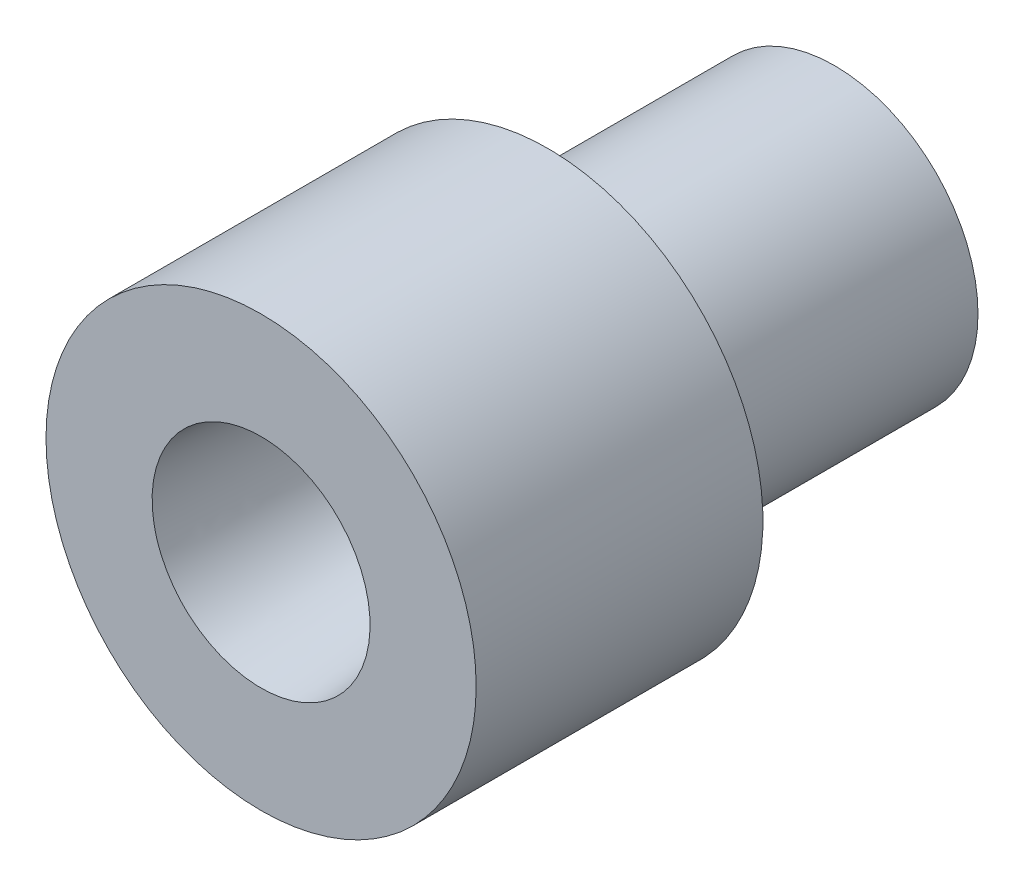
ISO-10303-21;
HEADER;
FILE_DESCRIPTION(('STEP AP214'),'2;1');
FILE_NAME('part.step','',(''),(''),'','','');
FILE_SCHEMA(('AUTOMOTIVE_DESIGN { 1 0 10303 214 1 1 1 1 }'));
ENDSEC;
DATA;
#1=APPLICATION_CONTEXT('core data for automotive mechanical design processes');
#2=APPLICATION_PROTOCOL_DEFINITION('international standard','automotive_design',2000,#1);
#3=PRODUCT_CONTEXT('',#1,'mechanical');
#4=PRODUCT('Part','Part','',(#3));
#5=PRODUCT_RELATED_PRODUCT_CATEGORY('part','',(#4));
#6=PRODUCT_DEFINITION_FORMATION('','',#4);
#7=PRODUCT_DEFINITION_CONTEXT('part definition',#1,'design');
#8=PRODUCT_DEFINITION('design','',#6,#7);
#9=PRODUCT_DEFINITION_SHAPE('','',#8);
#10=(LENGTH_UNIT() NAMED_UNIT(*) SI_UNIT(.MILLI.,.METRE.));
#11=(NAMED_UNIT(*) PLANE_ANGLE_UNIT() SI_UNIT($,.RADIAN.));
#12=(NAMED_UNIT(*) SI_UNIT($,.STERADIAN.) SOLID_ANGLE_UNIT());
#13=UNCERTAINTY_MEASURE_WITH_UNIT(LENGTH_MEASURE(1.E-05),#10,'distance_accuracy_value','');
#14=(GEOMETRIC_REPRESENTATION_CONTEXT(3) GLOBAL_UNCERTAINTY_ASSIGNED_CONTEXT((#13)) GLOBAL_UNIT_ASSIGNED_CONTEXT((#10,
#11,#12)) REPRESENTATION_CONTEXT('',''));
#15=CARTESIAN_POINT('',(0.,0.,0.));
#16=DIRECTION('',(0.,0.,1.));
#17=DIRECTION('',(1.,0.,0.));
#18=AXIS2_PLACEMENT_3D('',#15,#16,#17);
#19=CARTESIAN_POINT('',(0.,0.,25.4));
#20=DIRECTION('',(0.,0.,-1.));
#21=DIRECTION('',(-1.,0.,0.));
#22=AXIS2_PLACEMENT_3D('',#19,#20,#21);
#23=CYLINDRICAL_SURFACE('',#22,9.525);
#24=CARTESIAN_POINT('',(0.,0.,25.4));
#25=DIRECTION('',(0.,0.,1.));
#26=DIRECTION('',(1.,0.,0.));
#27=AXIS2_PLACEMENT_3D('',#24,#25,#26);
#28=CIRCLE('',#27,9.525);
#29=CARTESIAN_POINT('',(9.525,0.,25.4));
#30=VERTEX_POINT('',#29);
#31=EDGE_CURVE('E11',#30,#30,#28,.T.);
#32=ORIENTED_EDGE('',*,*,#31,.F.);
#33=EDGE_LOOP('',(#32));
#34=FACE_BOUND('',#33,.T.);
#35=CARTESIAN_POINT('',(0.,0.,12.7));
#36=DIRECTION('',(0.,0.,-1.));
#37=DIRECTION('',(-1.,0.,0.));
#38=AXIS2_PLACEMENT_3D('',#35,#36,#37);
#39=CIRCLE('',#38,9.525);
#40=CARTESIAN_POINT('',(-9.525,0.,12.7));
#41=VERTEX_POINT('',#40);
#42=EDGE_CURVE('E48',#41,#41,#39,.T.);
#43=ORIENTED_EDGE('',*,*,#42,.F.);
#44=EDGE_LOOP('',(#43));
#45=FACE_BOUND('',#44,.T.);
#46=ADVANCED_FACE('F34',(#34,#45),#23,.T.);
#47=CARTESIAN_POINT('',(0.,0.,0.));
#48=DIRECTION('',(0.,0.,1.));
#49=DIRECTION('',(1.,0.,0.));
#50=AXIS2_PLACEMENT_3D('',#47,#48,#49);
#51=PLANE('',#50);
#52=CARTESIAN_POINT('',(0.,0.,0.));
#53=DIRECTION('',(0.,0.,-1.));
#54=DIRECTION('',(-1.,0.,0.));
#55=AXIS2_PLACEMENT_3D('',#52,#53,#54);
#56=CIRCLE('',#55,2.38125);
#57=CARTESIAN_POINT('',(2.24599372943036,0.791115497168073,0.));
#58=VERTEX_POINT('',#57);
#59=EDGE_CURVE('E40',#58,#58,#56,.T.);
#60=ORIENTED_EDGE('',*,*,#59,.F.);
#61=EDGE_LOOP('',(#60));
#62=FACE_BOUND('',#61,.T.);
#63=CARTESIAN_POINT('',(0.,0.,0.));
#64=DIRECTION('',(0.,0.,-1.));
#65=DIRECTION('',(-1.,0.,0.));
#66=AXIS2_PLACEMENT_3D('',#63,#64,#65);
#67=CIRCLE('',#66,6.35);
#68=CARTESIAN_POINT('',(-6.35,0.,0.));
#69=VERTEX_POINT('',#68);
#70=EDGE_CURVE('E54',#69,#69,#67,.T.);
#71=ORIENTED_EDGE('',*,*,#70,.T.);
#72=EDGE_LOOP('',(#71));
#73=FACE_BOUND('',#72,.T.);
#74=ADVANCED_FACE('F71',(#62,#73),#51,.F.);
#75=CARTESIAN_POINT('',(0.,0.,25.4));
#76=DIRECTION('',(0.,0.,1.));
#77=DIRECTION('',(1.,0.,0.));
#78=AXIS2_PLACEMENT_3D('',#75,#76,#77);
#79=PLANE('',#78);
#80=CARTESIAN_POINT('',(0.,0.,25.4));
#81=DIRECTION('',(0.,0.,1.));
#82=DIRECTION('',(1.,0.,0.));
#83=AXIS2_PLACEMENT_3D('',#80,#81,#82);
#84=CIRCLE('',#83,4.826);
#85=CARTESIAN_POINT('',(4.18900765540141,2.39634948682124,25.4));
#86=VERTEX_POINT('',#85);
#87=EDGE_CURVE('E44',#86,#86,#84,.T.);
#88=ORIENTED_EDGE('',*,*,#87,.F.);
#89=EDGE_LOOP('',(#88));
#90=FACE_BOUND('',#89,.T.);
#91=ORIENTED_EDGE('',*,*,#31,.T.);
#92=EDGE_LOOP('',(#91));
#93=FACE_BOUND('',#92,.T.);
#94=ADVANCED_FACE('F76',(#90,#93),#79,.T.);
#95=CARTESIAN_POINT('',(4.18900765540141,2.39634948682124,25.4));
#96=CARTESIAN_POINT('',(2.24599372943036,0.791115497168073,0.));
#97=CARTESIAN_POINT('',(8.98170662904388,-5.98166582398158,25.4));
#98=CARTESIAN_POINT('',(3.82822472376651,-3.70087196169266,0.));
#99=CARTESIAN_POINT('',(0.603691318241062,-10.774364797624,25.4));
#100=CARTESIAN_POINT('',(-0.663762735094221,-5.2831029560288,0.));
#101=CARTESIAN_POINT('',(-4.18900765540141,-2.39634948682124,25.4));
#102=CARTESIAN_POINT('',(-2.24599372943036,-0.791115497168071,0.));
#103=CARTESIAN_POINT('',(-8.98170662904388,5.98166582398158,25.4));
#104=CARTESIAN_POINT('',(-3.82822472376651,3.70087196169266,0.));
#105=CARTESIAN_POINT('',(-0.603691318241063,10.774364797624,25.4));
#106=CARTESIAN_POINT('',(0.663762735094223,5.2831029560288,0.));
#107=CARTESIAN_POINT('',(4.18900765540141,2.39634948682124,25.4));
#108=CARTESIAN_POINT('',(2.24599372943036,0.791115497168073,0.));
#109=(BOUNDED_SURFACE() B_SPLINE_SURFACE(3,1,((#95,#96),(#97,#98),(#99,#100),(#101,#102),(#103,
#104),(#105,#106),(#107,#108)),.UNSPECIFIED.,.T.,.F.,.F.) B_SPLINE_SURFACE_WITH_KNOTS((4,3,4),
(2,2),(0.,0.5,1.),(0.,1.),
.UNSPECIFIED.) GEOMETRIC_REPRESENTATION_ITEM() RATIONAL_B_SPLINE_SURFACE(((1.,1.),
(0.333333333333333,0.333333333333333),(0.333333333333333,0.333333333333333),(1.,1.),
(0.333333333333333,0.333333333333333),(0.333333333333333,0.333333333333333),(1.,1.))) REPRESENTATION_ITEM('') SURFACE());
#110=CARTESIAN_POINT('',(4.18900765540141,2.39634948682124,25.4));
#111=CARTESIAN_POINT('',(4.16876792700588,2.37962829942901,25.1354166666667));
#112=CARTESIAN_POINT('',(4.14852819861034,2.36290711203679,24.8708333333333));
#113=CARTESIAN_POINT('',(4.10804874181928,2.32946473725235,24.3416666666667));
#114=CARTESIAN_POINT('',(4.08780901342375,2.31274354986013,24.0770833333333));
#115=CARTESIAN_POINT('',(4.04732955663269,2.27930117507569,23.5479166666667));
#116=CARTESIAN_POINT('',(4.02708982823715,2.26257998768347,23.2833333333333));
#117=CARTESIAN_POINT('',(3.98661037144609,2.22913761289903,22.7541666666667));
#118=CARTESIAN_POINT('',(3.96637064305056,2.21241642550681,22.4895833333333));
#119=CARTESIAN_POINT('',(3.9258911862595,2.17897405072237,21.9604166666667));
#120=CARTESIAN_POINT('',(3.90565145786396,2.16225286333015,21.6958333333333));
#121=CARTESIAN_POINT('',(3.8651720010729,2.12881048854571,21.1666666666667));
#122=CARTESIAN_POINT('',(3.84493227267737,2.11208930115349,20.9020833333333));
#123=CARTESIAN_POINT('',(3.80445281588631,2.07864692636905,20.3729166666667));
#124=CARTESIAN_POINT('',(3.78421308749077,2.06192573897683,20.1083333333333));
#125=CARTESIAN_POINT('',(3.74373363069971,2.02848336419239,19.5791666666667));
#126=CARTESIAN_POINT('',(3.72349390230418,2.01176217680017,19.3145833333333));
#127=CARTESIAN_POINT('',(3.68301444551311,1.97831980201572,18.7854166666667));
#128=CARTESIAN_POINT('',(3.66277471711758,1.9615986146235,18.5208333333333));
#129=CARTESIAN_POINT('',(3.62229526032652,1.92815623983906,17.9916666666667));
#130=CARTESIAN_POINT('',(3.60205553193099,1.91143505244684,17.7270833333333));
#131=CARTESIAN_POINT('',(3.56157607513992,1.8779926776624,17.1979166666667));
#132=CARTESIAN_POINT('',(3.54133634674439,1.86127149027018,16.9333333333333));
#133=CARTESIAN_POINT('',(3.50085688995333,1.82782911548574,16.4041666666667));
#134=CARTESIAN_POINT('',(3.4806171615578,1.81110792809352,16.1395833333333));
#135=CARTESIAN_POINT('',(3.44013770476673,1.77766555330908,15.6104166666667));
#136=CARTESIAN_POINT('',(3.4198979763712,1.76094436591686,15.3458333333333));
#137=CARTESIAN_POINT('',(3.37941851958014,1.72750199113242,14.8166666666667));
#138=CARTESIAN_POINT('',(3.35917879118461,1.7107808037402,14.5520833333333));
#139=CARTESIAN_POINT('',(3.31869933439354,1.67733842895576,14.0229166666667));
#140=CARTESIAN_POINT('',(3.29845960599801,1.66061724156354,13.7583333333333));
#141=CARTESIAN_POINT('',(3.25798014920695,1.6271748667791,13.2291666666667));
#142=CARTESIAN_POINT('',(3.23774042081142,1.61045367938687,12.9645833333333));
#143=CARTESIAN_POINT('',(3.19726096402035,1.57701130460243,12.4354166666667));
#144=CARTESIAN_POINT('',(3.17702123562482,1.56029011721021,12.1708333333333));
#145=CARTESIAN_POINT('',(3.13654177883376,1.52684774242577,11.6416666666667));
#146=CARTESIAN_POINT('',(3.11630205043823,1.51012655503355,11.3770833333333));
#147=CARTESIAN_POINT('',(3.07582259364716,1.47668418024911,10.8479166666667));
#148=CARTESIAN_POINT('',(3.05558286525163,1.45996299285689,10.5833333333333));
#149=CARTESIAN_POINT('',(3.01510340846057,1.42652061807245,10.0541666666667));
#150=CARTESIAN_POINT('',(2.99486368006504,1.40979943068023,9.78958333333333));
#151=CARTESIAN_POINT('',(2.95438422327397,1.37635705589579,9.26041666666666));
#152=CARTESIAN_POINT('',(2.93414449487844,1.35963586850357,8.99583333333333));
#153=CARTESIAN_POINT('',(2.89366503808738,1.32619349371913,8.46666666666667));
#154=CARTESIAN_POINT('',(2.87342530969185,1.30947230632691,8.20208333333333));
#155=CARTESIAN_POINT('',(2.83294585290078,1.27602993154247,7.67291666666667));
#156=CARTESIAN_POINT('',(2.81270612450525,1.25930874415025,7.40833333333333));
#157=CARTESIAN_POINT('',(2.77222666771419,1.2258663693658,6.87916666666667));
#158=CARTESIAN_POINT('',(2.75198693931866,1.20914518197358,6.61458333333333));
#159=CARTESIAN_POINT('',(2.71150748252759,1.17570280718914,6.08541666666667));
#160=CARTESIAN_POINT('',(2.69126775413206,1.15898161979692,5.82083333333333));
#161=CARTESIAN_POINT('',(2.650788297341,1.12553924501248,5.29166666666667));
#162=CARTESIAN_POINT('',(2.63054856894547,1.10881805762026,5.02708333333333));
#163=CARTESIAN_POINT('',(2.5900691121544,1.07537568283582,4.49791666666667));
#164=CARTESIAN_POINT('',(2.56982938375887,1.0586544954436,4.23333333333333));
#165=CARTESIAN_POINT('',(2.52934992696781,1.02521212065916,3.70416666666667));
#166=CARTESIAN_POINT('',(2.50911019857228,1.00849093326694,3.43958333333333));
#167=CARTESIAN_POINT('',(2.46863074178121,0.975048558482498,2.91041666666667));
#168=CARTESIAN_POINT('',(2.44839101338568,0.958327371090277,2.64583333333333));
#169=CARTESIAN_POINT('',(2.40791155659462,0.924884996305837,2.11666666666667));
#170=CARTESIAN_POINT('',(2.38767182819909,0.908163808913616,1.85208333333333));
#171=CARTESIAN_POINT('',(2.34719237140802,0.874721434129175,1.32291666666667));
#172=CARTESIAN_POINT('',(2.32695264301249,0.858000246736955,1.05833333333333));
#173=CARTESIAN_POINT('',(2.28647318622143,0.824557871952514,0.529166666666667));
#174=CARTESIAN_POINT('',(2.2662334578259,0.807836684560293,0.264583333333333));
#175=CARTESIAN_POINT('',(2.24599372943036,0.791115497168073,0.));
#176=B_SPLINE_CURVE_WITH_KNOTS('',3,(#110,#111,#112,#113,#114,#115,#116,#117,#118,#119,#120,
#121,#122,#123,#124,#125,#126,#127,#128,#129,#130,#131,#132,#133,#134,#135,#136,#137,#138,#139,
#140,#141,#142,#143,#144,#145,#146,#147,#148,#149,#150,#151,#152,#153,#154,#155,#156,#157,#158,
#159,#160,#161,#162,#163,#164,#165,#166,#167,#168,#169,#170,#171,#172,#173,#174,#175),
.UNSPECIFIED.,.F.,.F.,(4,2,2,2,2,2,2,2,2,2,2,2,2,2,2,2,2,2,2,2,2,2,2,2,2,2,2,2,2,2,2,2,4),(0.,
0.797647958011537,1.59529591602307,2.39294387403461,3.19059183204615,3.98823979005769,
4.78588774806923,5.58353570608076,6.3811836640923,7.17883162210384,7.97647958011538,
8.77412753812691,9.57177549613845,10.36942345415,11.1670714121615,11.9647193701731,
12.7623673281846,13.5600152861961,14.3576632442077,15.1553112022192,15.9529591602308,
16.7506071182423,17.5482550762538,18.3459030342654,19.1435509922769,19.9411989502884,
20.7388469083,21.5364948663115,22.334142824323,23.1317907823346,23.9294387403461,
24.7270866983577,25.5247346563692),.UNSPECIFIED.);
#177=EDGE_CURVE('BSEAM66',#86,#58,#176,.T.);
#178=ORIENTED_EDGE('',*,*,#87,.T.);
#179=ORIENTED_EDGE('',*,*,#59,.T.);
#180=ORIENTED_EDGE('',*,*,#177,.T.);
#181=ORIENTED_EDGE('',*,*,#177,.F.);
#182=EDGE_LOOP('',(#178,#180,#179,#181));
#183=FACE_BOUND('',#182,.T.);
#184=ADVANCED_FACE('F66',(#183),#109,.F.);
#185=CARTESIAN_POINT('',(0.,0.,12.7));
#186=DIRECTION('',(0.,0.,-1.));
#187=DIRECTION('',(-1.,0.,0.));
#188=AXIS2_PLACEMENT_3D('',#185,#186,#187);
#189=PLANE('',#188);
#190=CARTESIAN_POINT('',(0.,0.,12.7));
#191=DIRECTION('',(0.,0.,-1.));
#192=DIRECTION('',(-1.,0.,0.));
#193=AXIS2_PLACEMENT_3D('',#190,#191,#192);
#194=CIRCLE('',#193,6.35);
#195=CARTESIAN_POINT('',(-6.35,0.,12.7));
#196=VERTEX_POINT('',#195);
#197=EDGE_CURVE('E53',#196,#196,#194,.T.);
#198=ORIENTED_EDGE('',*,*,#197,.F.);
#199=EDGE_LOOP('',(#198));
#200=FACE_BOUND('',#199,.T.);
#201=ORIENTED_EDGE('',*,*,#42,.T.);
#202=EDGE_LOOP('',(#201));
#203=FACE_BOUND('',#202,.T.);
#204=ADVANCED_FACE('F63',(#200,#203),#189,.T.);
#205=CARTESIAN_POINT('',(0.,0.,12.7));
#206=DIRECTION('',(0.,0.,-1.));
#207=DIRECTION('',(-1.,0.,0.));
#208=AXIS2_PLACEMENT_3D('',#205,#206,#207);
#209=CYLINDRICAL_SURFACE('',#208,6.35);
#210=CARTESIAN_POINT('',(-6.35,0.,12.7));
#211=CARTESIAN_POINT('',(-6.35,0.,12.5677083333333));
#212=CARTESIAN_POINT('',(-6.35,0.,12.4354166666667));
#213=CARTESIAN_POINT('',(-6.35,0.,12.1708333333333));
#214=CARTESIAN_POINT('',(-6.35,0.,12.0385416666667));
#215=CARTESIAN_POINT('',(-6.35,0.,11.7739583333333));
#216=CARTESIAN_POINT('',(-6.35,0.,11.6416666666667));
#217=CARTESIAN_POINT('',(-6.35,0.,11.3770833333333));
#218=CARTESIAN_POINT('',(-6.35,0.,11.2447916666667));
#219=CARTESIAN_POINT('',(-6.35,0.,10.9802083333333));
#220=CARTESIAN_POINT('',(-6.35,0.,10.8479166666667));
#221=CARTESIAN_POINT('',(-6.35,0.,10.5833333333333));
#222=CARTESIAN_POINT('',(-6.35,0.,10.4510416666667));
#223=CARTESIAN_POINT('',(-6.35,0.,10.1864583333333));
#224=CARTESIAN_POINT('',(-6.35,0.,10.0541666666667));
#225=CARTESIAN_POINT('',(-6.35,0.,9.78958333333334));
#226=CARTESIAN_POINT('',(-6.35,0.,9.65729166666667));
#227=CARTESIAN_POINT('',(-6.35,0.,9.39270833333333));
#228=CARTESIAN_POINT('',(-6.35,0.,9.26041666666667));
#229=CARTESIAN_POINT('',(-6.35,0.,8.99583333333334));
#230=CARTESIAN_POINT('',(-6.35,0.,8.86354166666667));
#231=CARTESIAN_POINT('',(-6.35,0.,8.59895833333334));
#232=CARTESIAN_POINT('',(-6.35,0.,8.46666666666667));
#233=CARTESIAN_POINT('',(-6.35,0.,8.20208333333334));
#234=CARTESIAN_POINT('',(-6.35,0.,8.06979166666667));
#235=CARTESIAN_POINT('',(-6.35,0.,7.80520833333333));
#236=CARTESIAN_POINT('',(-6.35,0.,7.67291666666667));
#237=CARTESIAN_POINT('',(-6.35,0.,7.40833333333333));
#238=CARTESIAN_POINT('',(-6.35,0.,7.27604166666667));
#239=CARTESIAN_POINT('',(-6.35,0.,7.01145833333333));
#240=CARTESIAN_POINT('',(-6.35,0.,6.87916666666667));
#241=CARTESIAN_POINT('',(-6.35,0.,6.61458333333333));
#242=CARTESIAN_POINT('',(-6.35,0.,6.48229166666667));
#243=CARTESIAN_POINT('',(-6.35,0.,6.21770833333333));
#244=CARTESIAN_POINT('',(-6.35,0.,6.08541666666667));
#245=CARTESIAN_POINT('',(-6.35,0.,5.82083333333333));
#246=CARTESIAN_POINT('',(-6.35,0.,5.68854166666667));
#247=CARTESIAN_POINT('',(-6.35,0.,5.42395833333333));
#248=CARTESIAN_POINT('',(-6.35,0.,5.29166666666667));
#249=CARTESIAN_POINT('',(-6.35,0.,5.02708333333333));
#250=CARTESIAN_POINT('',(-6.35,0.,4.89479166666667));
#251=CARTESIAN_POINT('',(-6.35,0.,4.63020833333333));
#252=CARTESIAN_POINT('',(-6.35,0.,4.49791666666667));
#253=CARTESIAN_POINT('',(-6.35,0.,4.23333333333333));
#254=CARTESIAN_POINT('',(-6.35,0.,4.10104166666667));
#255=CARTESIAN_POINT('',(-6.35,0.,3.83645833333333));
#256=CARTESIAN_POINT('',(-6.35,0.,3.70416666666667));
#257=CARTESIAN_POINT('',(-6.35,0.,3.43958333333333));
#258=CARTESIAN_POINT('',(-6.35,0.,3.30729166666667));
#259=CARTESIAN_POINT('',(-6.35,0.,3.04270833333333));
#260=CARTESIAN_POINT('',(-6.35,0.,2.91041666666667));
#261=CARTESIAN_POINT('',(-6.35,0.,2.64583333333333));
#262=CARTESIAN_POINT('',(-6.35,0.,2.51354166666667));
#263=CARTESIAN_POINT('',(-6.35,0.,2.24895833333333));
#264=CARTESIAN_POINT('',(-6.35,0.,2.11666666666667));
#265=CARTESIAN_POINT('',(-6.35,0.,1.85208333333333));
#266=CARTESIAN_POINT('',(-6.35,0.,1.71979166666667));
#267=CARTESIAN_POINT('',(-6.35,0.,1.45520833333333));
#268=CARTESIAN_POINT('',(-6.35,0.,1.32291666666667));
#269=CARTESIAN_POINT('',(-6.35,0.,1.05833333333333));
#270=CARTESIAN_POINT('',(-6.35,0.,0.926041666666666));
#271=CARTESIAN_POINT('',(-6.35,0.,0.661458333333333));
#272=CARTESIAN_POINT('',(-6.35,0.,0.529166666666666));
#273=CARTESIAN_POINT('',(-6.35,0.,0.264583333333333));
#274=CARTESIAN_POINT('',(-6.35,0.,0.132291666666667));
#275=CARTESIAN_POINT('',(-6.35,0.,0.));
#276=B_SPLINE_CURVE_WITH_KNOTS('',3,(#210,#211,#212,#213,#214,#215,#216,#217,#218,#219,#220,
#221,#222,#223,#224,#225,#226,#227,#228,#229,#230,#231,#232,#233,#234,#235,#236,#237,#238,#239,
#240,#241,#242,#243,#244,#245,#246,#247,#248,#249,#250,#251,#252,#253,#254,#255,#256,#257,#258,
#259,#260,#261,#262,#263,#264,#265,#266,#267,#268,#269,#270,#271,#272,#273,#274,#275),
.UNSPECIFIED.,.F.,.F.,(4,2,2,2,2,2,2,2,2,2,2,2,2,2,2,2,2,2,2,2,2,2,2,2,2,2,2,2,2,2,2,2,4),(0.,
0.396875,0.793749999999999,1.190625,1.5875,1.984375,2.38125,2.778125,3.175,3.571875,3.96875,
4.365625,4.7625,5.159375,5.55625,5.953125,6.35,6.746875,7.14375,7.540625,7.9375,8.334375,
8.73125,9.128125,9.525,9.921875,10.31875,10.715625,11.1125,11.509375,11.90625,12.303125,12.7),.UNSPECIFIED.);
#277=EDGE_CURVE('BSEAM60',#196,#69,#276,.T.);
#278=ORIENTED_EDGE('',*,*,#197,.T.);
#279=ORIENTED_EDGE('',*,*,#70,.F.);
#280=ORIENTED_EDGE('',*,*,#277,.T.);
#281=ORIENTED_EDGE('',*,*,#277,.F.);
#282=EDGE_LOOP('',(#278,#280,#279,#281));
#283=FACE_BOUND('',#282,.T.);
#284=ADVANCED_FACE('F60',(#283),#209,.T.);
#285=CLOSED_SHELL('',(#46,#74,#94,#184,#204,#284));
#286=MANIFOLD_SOLID_BREP('B2',#285);
#287=ADVANCED_BREP_SHAPE_REPRESENTATION('',(#18,#286),#14);
#288=SHAPE_DEFINITION_REPRESENTATION(#9,#287);
ENDSEC;
END-ISO-10303-21;
